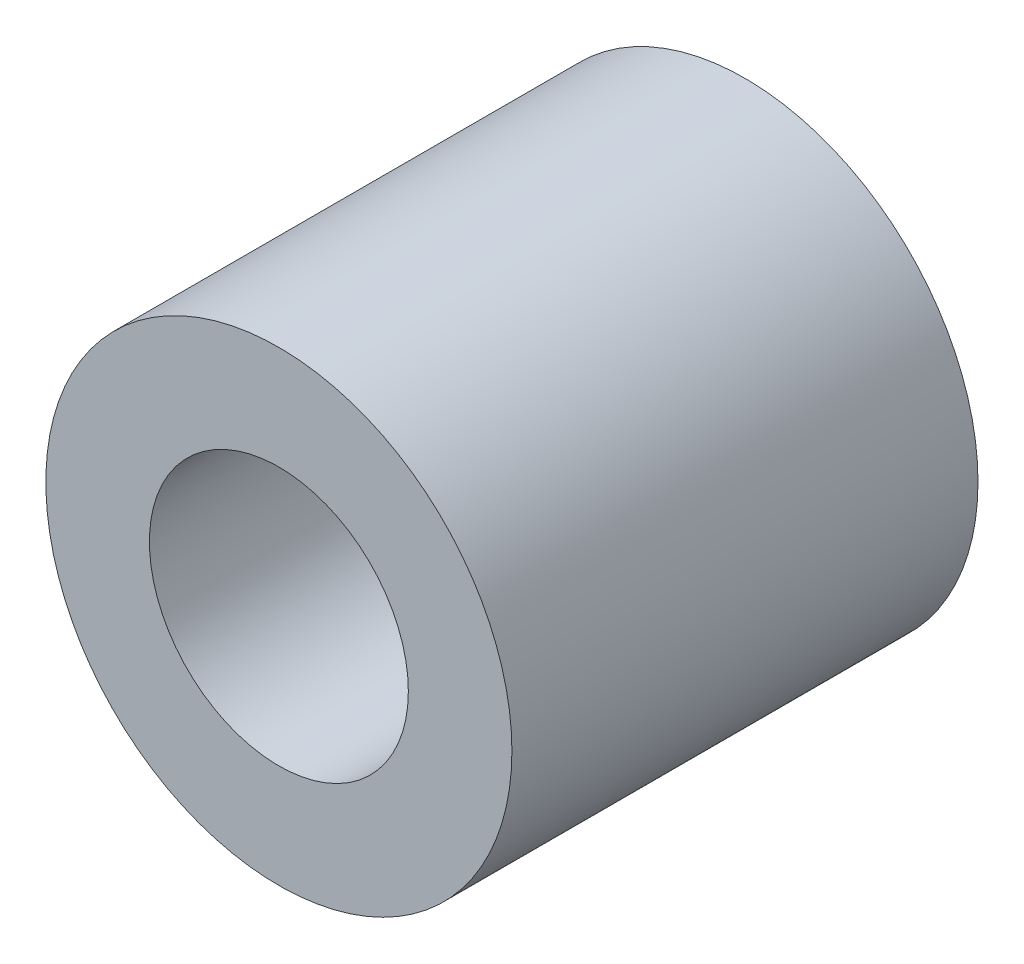
ISO-10303-21;
HEADER;
FILE_DESCRIPTION(('STEP AP214'),'2;1');
FILE_NAME('part.step','',(''),(''),'','','');
FILE_SCHEMA(('AUTOMOTIVE_DESIGN { 1 0 10303 214 1 1 1 1 }'));
ENDSEC;
DATA;
#1=APPLICATION_CONTEXT('core data for automotive mechanical design processes');
#2=APPLICATION_PROTOCOL_DEFINITION('international standard','automotive_design',2000,#1);
#3=PRODUCT_CONTEXT('',#1,'mechanical');
#4=PRODUCT('Part','Part','',(#3));
#5=PRODUCT_RELATED_PRODUCT_CATEGORY('part','',(#4));
#6=PRODUCT_DEFINITION_FORMATION('','',#4);
#7=PRODUCT_DEFINITION_CONTEXT('part definition',#1,'design');
#8=PRODUCT_DEFINITION('design','',#6,#7);
#9=PRODUCT_DEFINITION_SHAPE('','',#8);
#10=(LENGTH_UNIT() NAMED_UNIT(*) SI_UNIT(.MILLI.,.METRE.));
#11=(NAMED_UNIT(*) PLANE_ANGLE_UNIT() SI_UNIT($,.RADIAN.));
#12=(NAMED_UNIT(*) SI_UNIT($,.STERADIAN.) SOLID_ANGLE_UNIT());
#13=UNCERTAINTY_MEASURE_WITH_UNIT(LENGTH_MEASURE(1.E-05),#10,'distance_accuracy_value','');
#14=(GEOMETRIC_REPRESENTATION_CONTEXT(3) GLOBAL_UNCERTAINTY_ASSIGNED_CONTEXT((#13)) GLOBAL_UNIT_ASSIGNED_CONTEXT((#10,
#11,#12)) REPRESENTATION_CONTEXT('',''));
#15=CARTESIAN_POINT('',(0.,0.,0.));
#16=DIRECTION('',(0.,0.,1.));
#17=DIRECTION('',(1.,0.,0.));
#18=AXIS2_PLACEMENT_3D('',#15,#16,#17);
#19=CARTESIAN_POINT('',(0.,0.,9.));
#20=DIRECTION('',(0.,0.,-1.));
#21=DIRECTION('',(-1.,0.,0.));
#22=AXIS2_PLACEMENT_3D('',#19,#20,#21);
#23=CYLINDRICAL_SURFACE('',#22,4.5);
#24=CARTESIAN_POINT('',(0.,0.,9.));
#25=DIRECTION('',(0.,0.,1.));
#26=DIRECTION('',(1.,0.,0.));
#27=AXIS2_PLACEMENT_3D('',#24,#25,#26);
#28=CIRCLE('',#27,4.5);
#29=CARTESIAN_POINT('',(4.5,0.,9.));
#30=VERTEX_POINT('',#29);
#31=EDGE_CURVE('E10',#30,#30,#28,.T.);
#32=ORIENTED_EDGE('',*,*,#31,.F.);
#33=EDGE_LOOP('',(#32));
#34=FACE_BOUND('',#33,.T.);
#35=CARTESIAN_POINT('',(0.,0.,0.));
#36=DIRECTION('',(0.,0.,1.));
#37=DIRECTION('',(1.,0.,0.));
#38=AXIS2_PLACEMENT_3D('',#35,#36,#37);
#39=CIRCLE('',#38,4.5);
#40=CARTESIAN_POINT('',(4.5,0.,0.));
#41=VERTEX_POINT('',#40);
#42=EDGE_CURVE('E44',#41,#41,#39,.T.);
#43=ORIENTED_EDGE('',*,*,#42,.T.);
#44=EDGE_LOOP('',(#43));
#45=FACE_BOUND('',#44,.T.);
#46=ADVANCED_FACE('F41',(#34,#45),#23,.T.);
#47=CARTESIAN_POINT('',(0.,0.,9.));
#48=DIRECTION('',(0.,0.,1.));
#49=DIRECTION('',(1.,0.,0.));
#50=AXIS2_PLACEMENT_3D('',#47,#48,#49);
#51=PLANE('',#50);
#52=CARTESIAN_POINT('',(0.,0.,9.));
#53=DIRECTION('',(0.,0.,1.));
#54=DIRECTION('',(1.,0.,0.));
#55=AXIS2_PLACEMENT_3D('',#52,#53,#54);
#56=CIRCLE('',#55,2.5);
#57=CARTESIAN_POINT('',(2.5,0.,9.));
#58=VERTEX_POINT('',#57);
#59=EDGE_CURVE('E53',#58,#58,#56,.T.);
#60=ORIENTED_EDGE('',*,*,#59,.F.);
#61=EDGE_LOOP('',(#60));
#62=FACE_BOUND('',#61,.T.);
#63=ORIENTED_EDGE('',*,*,#31,.T.);
#64=EDGE_LOOP('',(#63));
#65=FACE_BOUND('',#64,.T.);
#66=ADVANCED_FACE('F81',(#62,#65),#51,.T.);
#67=CARTESIAN_POINT('',(0.,0.,0.));
#68=DIRECTION('',(0.,0.,1.));
#69=DIRECTION('',(1.,0.,0.));
#70=AXIS2_PLACEMENT_3D('',#67,#68,#69);
#71=PLANE('',#70);
#72=CARTESIAN_POINT('',(0.,0.,0.));
#73=DIRECTION('',(0.,0.,1.));
#74=DIRECTION('',(1.,0.,0.));
#75=AXIS2_PLACEMENT_3D('',#72,#73,#74);
#76=CIRCLE('',#75,1.75);
#77=CARTESIAN_POINT('',(1.75,0.,0.));
#78=VERTEX_POINT('',#77);
#79=EDGE_CURVE('E56',#78,#78,#76,.F.);
#80=ORIENTED_EDGE('',*,*,#79,.F.);
#81=EDGE_LOOP('',(#80));
#82=FACE_BOUND('',#81,.T.);
#83=ORIENTED_EDGE('',*,*,#42,.F.);
#84=EDGE_LOOP('',(#83));
#85=FACE_BOUND('',#84,.T.);
#86=ADVANCED_FACE('F77',(#82,#85),#71,.F.);
#87=CARTESIAN_POINT('',(0.,0.,4.7));
#88=DIRECTION('',(0.,0.,1.));
#89=DIRECTION('',(1.,0.,0.));
#90=AXIS2_PLACEMENT_3D('',#87,#88,#89);
#91=CYLINDRICAL_SURFACE('',#90,2.5);
#92=CARTESIAN_POINT('',(0.,0.,4.7));
#93=DIRECTION('',(0.,0.,1.));
#94=DIRECTION('',(1.,0.,0.));
#95=AXIS2_PLACEMENT_3D('',#92,#93,#94);
#96=CIRCLE('',#95,2.5);
#97=CARTESIAN_POINT('',(2.5,0.,4.7));
#98=VERTEX_POINT('',#97);
#99=EDGE_CURVE('E51',#98,#98,#96,.T.);
#100=CARTESIAN_POINT('',(2.5,0.,4.7));
#101=CARTESIAN_POINT('',(2.5,0.,4.74479166666667));
#102=CARTESIAN_POINT('',(2.5,0.,4.78958333333333));
#103=CARTESIAN_POINT('',(2.5,0.,4.87916666666667));
#104=CARTESIAN_POINT('',(2.5,0.,4.92395833333333));
#105=CARTESIAN_POINT('',(2.5,0.,5.01354166666667));
#106=CARTESIAN_POINT('',(2.5,0.,5.05833333333333));
#107=CARTESIAN_POINT('',(2.5,0.,5.14791666666667));
#108=CARTESIAN_POINT('',(2.5,0.,5.19270833333333));
#109=CARTESIAN_POINT('',(2.5,0.,5.28229166666667));
#110=CARTESIAN_POINT('',(2.5,0.,5.32708333333333));
#111=CARTESIAN_POINT('',(2.5,0.,5.41666666666667));
#112=CARTESIAN_POINT('',(2.5,0.,5.46145833333333));
#113=CARTESIAN_POINT('',(2.5,0.,5.55104166666667));
#114=CARTESIAN_POINT('',(2.5,0.,5.59583333333333));
#115=CARTESIAN_POINT('',(2.5,0.,5.68541666666667));
#116=CARTESIAN_POINT('',(2.5,0.,5.73020833333333));
#117=CARTESIAN_POINT('',(2.5,0.,5.81979166666667));
#118=CARTESIAN_POINT('',(2.5,0.,5.86458333333333));
#119=CARTESIAN_POINT('',(2.5,0.,5.95416666666667));
#120=CARTESIAN_POINT('',(2.5,0.,5.99895833333333));
#121=CARTESIAN_POINT('',(2.5,0.,6.08854166666667));
#122=CARTESIAN_POINT('',(2.5,0.,6.13333333333333));
#123=CARTESIAN_POINT('',(2.5,0.,6.22291666666667));
#124=CARTESIAN_POINT('',(2.5,0.,6.26770833333333));
#125=CARTESIAN_POINT('',(2.5,0.,6.35729166666667));
#126=CARTESIAN_POINT('',(2.5,0.,6.40208333333333));
#127=CARTESIAN_POINT('',(2.5,0.,6.49166666666667));
#128=CARTESIAN_POINT('',(2.5,0.,6.53645833333333));
#129=CARTESIAN_POINT('',(2.5,0.,6.62604166666667));
#130=CARTESIAN_POINT('',(2.5,0.,6.67083333333333));
#131=CARTESIAN_POINT('',(2.5,0.,6.76041666666667));
#132=CARTESIAN_POINT('',(2.5,0.,6.80520833333333));
#133=CARTESIAN_POINT('',(2.5,0.,6.89479166666667));
#134=CARTESIAN_POINT('',(2.5,0.,6.93958333333333));
#135=CARTESIAN_POINT('',(2.5,0.,7.02916666666667));
#136=CARTESIAN_POINT('',(2.5,0.,7.07395833333333));
#137=CARTESIAN_POINT('',(2.5,0.,7.16354166666667));
#138=CARTESIAN_POINT('',(2.5,0.,7.20833333333333));
#139=CARTESIAN_POINT('',(2.5,0.,7.29791666666666));
#140=CARTESIAN_POINT('',(2.5,0.,7.34270833333333));
#141=CARTESIAN_POINT('',(2.5,0.,7.43229166666667));
#142=CARTESIAN_POINT('',(2.5,0.,7.47708333333333));
#143=CARTESIAN_POINT('',(2.5,0.,7.56666666666667));
#144=CARTESIAN_POINT('',(2.5,0.,7.61145833333333));
#145=CARTESIAN_POINT('',(2.5,0.,7.70104166666667));
#146=CARTESIAN_POINT('',(2.5,0.,7.74583333333333));
#147=CARTESIAN_POINT('',(2.5,0.,7.83541666666667));
#148=CARTESIAN_POINT('',(2.5,0.,7.88020833333333));
#149=CARTESIAN_POINT('',(2.5,0.,7.96979166666666));
#150=CARTESIAN_POINT('',(2.5,0.,8.01458333333333));
#151=CARTESIAN_POINT('',(2.5,0.,8.10416666666667));
#152=CARTESIAN_POINT('',(2.5,0.,8.14895833333333));
#153=CARTESIAN_POINT('',(2.5,0.,8.23854166666666));
#154=CARTESIAN_POINT('',(2.5,0.,8.28333333333333));
#155=CARTESIAN_POINT('',(2.5,0.,8.37291666666667));
#156=CARTESIAN_POINT('',(2.5,0.,8.41770833333333));
#157=CARTESIAN_POINT('',(2.5,0.,8.50729166666667));
#158=CARTESIAN_POINT('',(2.5,0.,8.55208333333333));
#159=CARTESIAN_POINT('',(2.5,0.,8.64166666666667));
#160=CARTESIAN_POINT('',(2.5,0.,8.68645833333333));
#161=CARTESIAN_POINT('',(2.5,0.,8.77604166666667));
#162=CARTESIAN_POINT('',(2.5,0.,8.82083333333333));
#163=CARTESIAN_POINT('',(2.5,0.,8.91041666666666));
#164=CARTESIAN_POINT('',(2.5,0.,8.95520833333333));
#165=CARTESIAN_POINT('',(2.5,0.,9.));
#166=B_SPLINE_CURVE_WITH_KNOTS('',3,(#100,#101,#102,#103,#104,#105,#106,#107,#108,#109,#110,
#111,#112,#113,#114,#115,#116,#117,#118,#119,#120,#121,#122,#123,#124,#125,#126,#127,#128,#129,
#130,#131,#132,#133,#134,#135,#136,#137,#138,#139,#140,#141,#142,#143,#144,#145,#146,#147,#148,
#149,#150,#151,#152,#153,#154,#155,#156,#157,#158,#159,#160,#161,#162,#163,#164,#165),
.UNSPECIFIED.,.F.,.F.,(4,2,2,2,2,2,2,2,2,2,2,2,2,2,2,2,2,2,2,2,2,2,2,2,2,2,2,2,2,2,2,2,4),(0.,
0.134375,0.26875,0.403125,0.5375,0.671875,0.80625,0.940625,1.075,1.209375,1.34375,1.478125,
1.6125,1.746875,1.88125,2.015625,2.15,2.284375,2.41875,2.553125,2.6875,2.821875,2.95625,
3.090625,3.225,3.359375,3.49375,3.628125,3.7625,3.896875,4.03125,4.165625,4.3),.UNSPECIFIED.);
#167=EDGE_CURVE('BSEAM71',#98,#58,#166,.T.);
#168=ORIENTED_EDGE('',*,*,#99,.F.);
#169=ORIENTED_EDGE('',*,*,#59,.T.);
#170=ORIENTED_EDGE('',*,*,#167,.T.);
#171=ORIENTED_EDGE('',*,*,#167,.F.);
#172=EDGE_LOOP('',(#168,#170,#169,#171));
#173=FACE_BOUND('',#172,.T.);
#174=ADVANCED_FACE('F71',(#173),#91,.F.);
#175=CARTESIAN_POINT('',(0.,0.,4.7));
#176=DIRECTION('',(0.,0.,1.));
#177=DIRECTION('',(1.,0.,0.));
#178=AXIS2_PLACEMENT_3D('',#175,#176,#177);
#179=PLANE('',#178);
#180=CARTESIAN_POINT('',(0.,0.,4.7));
#181=DIRECTION('',(0.,0.,1.));
#182=DIRECTION('',(1.,0.,0.));
#183=AXIS2_PLACEMENT_3D('',#180,#181,#182);
#184=CIRCLE('',#183,1.75);
#185=CARTESIAN_POINT('',(1.75,0.,4.7));
#186=VERTEX_POINT('',#185);
#187=EDGE_CURVE('E61',#186,#186,#184,.T.);
#188=ORIENTED_EDGE('',*,*,#187,.F.);
#189=EDGE_LOOP('',(#188));
#190=FACE_BOUND('',#189,.T.);
#191=ORIENTED_EDGE('',*,*,#99,.T.);
#192=EDGE_LOOP('',(#191));
#193=FACE_BOUND('',#192,.T.);
#194=ADVANCED_FACE('F68',(#190,#193),#179,.T.);
#195=CARTESIAN_POINT('',(0.,0.,-0.00100000000000013));
#196=DIRECTION('',(0.,0.,1.));
#197=DIRECTION('',(1.,0.,0.));
#198=AXIS2_PLACEMENT_3D('',#195,#196,#197);
#199=CYLINDRICAL_SURFACE('',#198,1.75);
#200=ORIENTED_EDGE('',*,*,#187,.T.);
#201=EDGE_LOOP('',(#200));
#202=FACE_BOUND('',#201,.T.);
#203=ORIENTED_EDGE('',*,*,#79,.T.);
#204=EDGE_LOOP('',(#203));
#205=FACE_BOUND('',#204,.T.);
#206=ADVANCED_FACE('F65',(#202,#205),#199,.F.);
#207=CLOSED_SHELL('',(#46,#66,#86,#174,#194,#206));
#208=MANIFOLD_SOLID_BREP('B2',#207);
#209=ADVANCED_BREP_SHAPE_REPRESENTATION('',(#18,#208),#14);
#210=SHAPE_DEFINITION_REPRESENTATION(#9,#209);
ENDSEC;
END-ISO-10303-21;
